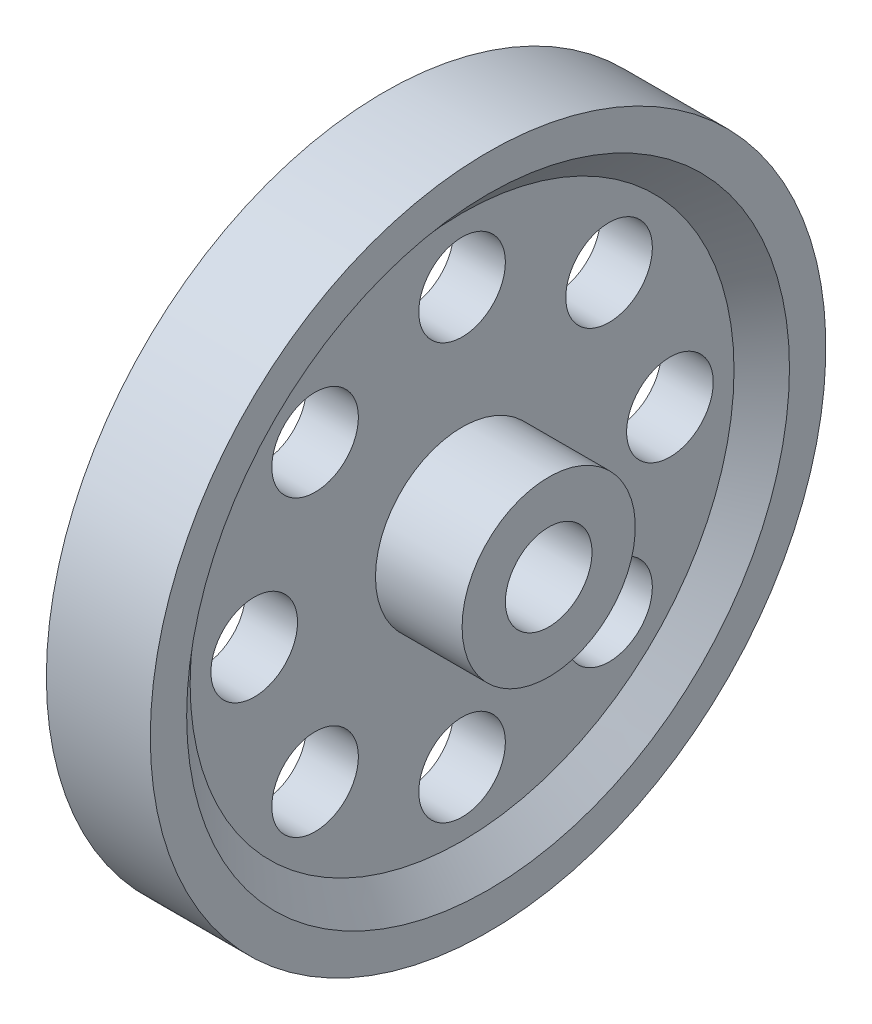
ISO-10303-21;
HEADER;
FILE_DESCRIPTION(('STEP AP214'),'2;1');
FILE_NAME('part.step','',(''),(''),'','','');
FILE_SCHEMA(('AUTOMOTIVE_DESIGN { 1 0 10303 214 1 1 1 1 }'));
ENDSEC;
DATA;
#1=APPLICATION_CONTEXT('core data for automotive mechanical design processes');
#2=APPLICATION_PROTOCOL_DEFINITION('international standard','automotive_design',2000,#1);
#3=PRODUCT_CONTEXT('',#1,'mechanical');
#4=PRODUCT('Part','Part','',(#3));
#5=PRODUCT_RELATED_PRODUCT_CATEGORY('part','',(#4));
#6=PRODUCT_DEFINITION_FORMATION('','',#4);
#7=PRODUCT_DEFINITION_CONTEXT('part definition',#1,'design');
#8=PRODUCT_DEFINITION('design','',#6,#7);
#9=PRODUCT_DEFINITION_SHAPE('','',#8);
#10=(LENGTH_UNIT() NAMED_UNIT(*) SI_UNIT(.MILLI.,.METRE.));
#11=(NAMED_UNIT(*) PLANE_ANGLE_UNIT() SI_UNIT($,.RADIAN.));
#12=(NAMED_UNIT(*) SI_UNIT($,.STERADIAN.) SOLID_ANGLE_UNIT());
#13=UNCERTAINTY_MEASURE_WITH_UNIT(LENGTH_MEASURE(1.E-05),#10,'distance_accuracy_value','');
#14=(GEOMETRIC_REPRESENTATION_CONTEXT(3) GLOBAL_UNCERTAINTY_ASSIGNED_CONTEXT((#13)) GLOBAL_UNIT_ASSIGNED_CONTEXT((#10,
#11,#12)) REPRESENTATION_CONTEXT('',''));
#15=CARTESIAN_POINT('',(0.,0.,0.));
#16=DIRECTION('',(0.,0.,1.));
#17=DIRECTION('',(1.,0.,0.));
#18=AXIS2_PLACEMENT_3D('',#15,#16,#17);
#19=CARTESIAN_POINT('',(0.,0.,0.));
#20=DIRECTION('',(-1.,0.,0.));
#21=DIRECTION('',(0.,0.,1.));
#22=AXIS2_PLACEMENT_3D('',#19,#20,#21);
#23=CYLINDRICAL_SURFACE('',#22,2.5);
#24=CARTESIAN_POINT('',(-1.,0.,0.));
#25=DIRECTION('',(-1.,0.,0.));
#26=DIRECTION('',(0.,0.,1.));
#27=AXIS2_PLACEMENT_3D('',#24,#25,#26);
#28=CIRCLE('',#27,2.5);
#29=CARTESIAN_POINT('',(-1.,0.,2.5));
#30=VERTEX_POINT('',#29);
#31=EDGE_CURVE('E71',#30,#30,#28,.T.);
#32=ORIENTED_EDGE('',*,*,#31,.T.);
#33=EDGE_LOOP('',(#32));
#34=FACE_BOUND('',#33,.T.);
#35=CARTESIAN_POINT('',(8.,0.,0.));
#36=DIRECTION('',(-1.,0.,0.));
#37=DIRECTION('',(0.,0.,1.));
#38=AXIS2_PLACEMENT_3D('',#35,#36,#37);
#39=CIRCLE('',#38,2.5);
#40=CARTESIAN_POINT('',(8.,0.,2.5));
#41=VERTEX_POINT('',#40);
#42=EDGE_CURVE('E10',#41,#41,#39,.T.);
#43=ORIENTED_EDGE('',*,*,#42,.F.);
#44=EDGE_LOOP('',(#43));
#45=FACE_BOUND('',#44,.T.);
#46=ADVANCED_FACE('F32',(#34,#45),#23,.F.);
#47=CARTESIAN_POINT('',(8.,0.,0.));
#48=DIRECTION('',(1.,0.,0.));
#49=DIRECTION('',(0.,0.,-1.));
#50=AXIS2_PLACEMENT_3D('',#47,#48,#49);
#51=PLANE('',#50);
#52=ORIENTED_EDGE('',*,*,#42,.T.);
#53=EDGE_LOOP('',(#52));
#54=FACE_BOUND('',#53,.T.);
#55=CARTESIAN_POINT('',(8.,0.,0.));
#56=DIRECTION('',(-1.,0.,0.));
#57=DIRECTION('',(0.,0.,1.));
#58=AXIS2_PLACEMENT_3D('',#55,#56,#57);
#59=CIRCLE('',#58,5.);
#60=CARTESIAN_POINT('',(8.,0.,5.));
#61=VERTEX_POINT('',#60);
#62=EDGE_CURVE('E39',#61,#61,#59,.T.);
#63=ORIENTED_EDGE('',*,*,#62,.F.);
#64=EDGE_LOOP('',(#63));
#65=FACE_BOUND('',#64,.T.);
#66=ADVANCED_FACE('F112',(#54,#65),#51,.T.);
#67=CARTESIAN_POINT('',(0.,0.,0.));
#68=DIRECTION('',(-1.,0.,0.));
#69=DIRECTION('',(0.,0.,1.));
#70=AXIS2_PLACEMENT_3D('',#67,#68,#69);
#71=CYLINDRICAL_SURFACE('',#70,5.);
#72=ORIENTED_EDGE('',*,*,#62,.T.);
#73=EDGE_LOOP('',(#72));
#74=FACE_BOUND('',#73,.T.);
#75=CARTESIAN_POINT('',(3.00000000000001,0.,0.));
#76=DIRECTION('',(-1.,0.,0.));
#77=DIRECTION('',(0.,0.,1.));
#78=AXIS2_PLACEMENT_3D('',#75,#76,#77);
#79=CIRCLE('',#78,5.);
#80=CARTESIAN_POINT('',(3.00000000000001,0.,5.));
#81=VERTEX_POINT('',#80);
#82=EDGE_CURVE('E44',#81,#81,#79,.T.);
#83=ORIENTED_EDGE('',*,*,#82,.F.);
#84=EDGE_LOOP('',(#83));
#85=FACE_BOUND('',#84,.T.);
#86=ADVANCED_FACE('F110',(#74,#85),#71,.T.);
#87=CARTESIAN_POINT('',(3.,0.,0.));
#88=DIRECTION('',(1.,0.,0.));
#89=DIRECTION('',(0.,0.,-1.));
#90=AXIS2_PLACEMENT_3D('',#87,#88,#89);
#91=PLANE('',#90);
#92=CARTESIAN_POINT('',(3.,8.48528137423785,8.48528137423827));
#93=DIRECTION('',(1.,0.,0.));
#94=DIRECTION('',(0.,0.,-1.));
#95=AXIS2_PLACEMENT_3D('',#92,#93,#94);
#96=CIRCLE('',#95,2.50000000000064);
#97=CARTESIAN_POINT('',(3.,8.48528137423785,5.98528137423763));
#98=VERTEX_POINT('',#97);
#99=EDGE_CURVE('E304',#98,#98,#96,.T.);
#100=ORIENTED_EDGE('',*,*,#99,.F.);
#101=EDGE_LOOP('',(#100));
#102=FACE_BOUND('',#101,.T.);
#103=CARTESIAN_POINT('',(3.,-1.02293661013471E-12,11.999999999999));
#104=DIRECTION('',(1.,0.,0.));
#105=DIRECTION('',(0.,0.,-1.));
#106=AXIS2_PLACEMENT_3D('',#103,#104,#105);
#107=CIRCLE('',#106,2.5000000000014);
#108=CARTESIAN_POINT('',(3.,-1.02293661013471E-12,9.49999999999758));
#109=VERTEX_POINT('',#108);
#110=EDGE_CURVE('E305',#109,#109,#107,.T.);
#111=ORIENTED_EDGE('',*,*,#110,.F.);
#112=EDGE_LOOP('',(#111));
#113=FACE_BOUND('',#112,.T.);
#114=CARTESIAN_POINT('',(3.,-8.48528137423929,8.48528137423683));
#115=DIRECTION('',(1.,0.,0.));
#116=DIRECTION('',(0.,0.,-1.));
#117=AXIS2_PLACEMENT_3D('',#114,#115,#116);
#118=CIRCLE('',#117,2.50000000000198);
#119=CARTESIAN_POINT('',(3.,-8.48528137423929,5.98528137423485));
#120=VERTEX_POINT('',#119);
#121=EDGE_CURVE('E307',#120,#120,#118,.T.);
#122=ORIENTED_EDGE('',*,*,#121,.F.);
#123=EDGE_LOOP('',(#122));
#124=FACE_BOUND('',#123,.T.);
#125=CARTESIAN_POINT('',(3.,-12.,-2.04293406795148E-12));
#126=DIRECTION('',(1.,0.,0.));
#127=DIRECTION('',(0.,0.,-1.));
#128=AXIS2_PLACEMENT_3D('',#125,#126,#127);
#129=CIRCLE('',#128,2.50000000000203);
#130=CARTESIAN_POINT('',(3.,-12.,-2.50000000000408));
#131=VERTEX_POINT('',#130);
#132=EDGE_CURVE('E312',#131,#131,#129,.T.);
#133=ORIENTED_EDGE('',*,*,#132,.F.);
#134=EDGE_LOOP('',(#133));
#135=FACE_BOUND('',#134,.T.);
#136=CARTESIAN_POINT('',(3.,-8.48528137423785,-8.48528137424031));
#137=DIRECTION('',(1.,0.,0.));
#138=DIRECTION('',(0.,0.,-1.));
#139=AXIS2_PLACEMENT_3D('',#136,#137,#138);
#140=CIRCLE('',#139,2.50000000000152);
#141=CARTESIAN_POINT('',(3.,-8.48528137423785,-10.9852813742418));
#142=VERTEX_POINT('',#141);
#143=EDGE_CURVE('E315',#142,#142,#140,.T.);
#144=ORIENTED_EDGE('',*,*,#143,.F.);
#145=EDGE_LOOP('',(#144));
#146=FACE_BOUND('',#145,.T.);
#147=CARTESIAN_POINT('',(3.,1.02146703397574E-12,-12.000000000001));
#148=DIRECTION('',(1.,0.,0.));
#149=DIRECTION('',(0.,0.,-1.));
#150=AXIS2_PLACEMENT_3D('',#147,#148,#149);
#151=CIRCLE('',#150,2.50000000000072);
#152=CARTESIAN_POINT('',(3.,1.02146703397574E-12,-14.5000000000017));
#153=VERTEX_POINT('',#152);
#154=EDGE_CURVE('E318',#153,#153,#151,.T.);
#155=ORIENTED_EDGE('',*,*,#154,.F.);
#156=EDGE_LOOP('',(#155));
#157=FACE_BOUND('',#156,.T.);
#158=CARTESIAN_POINT('',(3.,8.48528137423929,-8.48528137423887));
#159=DIRECTION('',(1.,0.,0.));
#160=DIRECTION('',(0.,0.,-1.));
#161=AXIS2_PLACEMENT_3D('',#158,#159,#160);
#162=CIRCLE('',#161,2.5000000000001);
#163=CARTESIAN_POINT('',(3.,8.48528137423929,-10.985281374239));
#164=VERTEX_POINT('',#163);
#165=EDGE_CURVE('E321',#164,#164,#162,.T.);
#166=ORIENTED_EDGE('',*,*,#165,.F.);
#167=EDGE_LOOP('',(#166));
#168=FACE_BOUND('',#167,.T.);
#169=CARTESIAN_POINT('',(3.,12.,0.));
#170=DIRECTION('',(1.,0.,0.));
#171=DIRECTION('',(0.,0.,-1.));
#172=AXIS2_PLACEMENT_3D('',#169,#170,#171);
#173=CIRCLE('',#172,2.5);
#174=CARTESIAN_POINT('',(3.,12.,-2.5));
#175=VERTEX_POINT('',#174);
#176=EDGE_CURVE('E52',#175,#175,#173,.T.);
#177=ORIENTED_EDGE('',*,*,#176,.F.);
#178=EDGE_LOOP('',(#177));
#179=FACE_BOUND('',#178,.T.);
#180=ORIENTED_EDGE('',*,*,#82,.T.);
#181=EDGE_LOOP('',(#180));
#182=FACE_BOUND('',#181,.T.);
#183=CARTESIAN_POINT('',(3.,0.,0.));
#184=DIRECTION('',(-1.,0.,0.));
#185=DIRECTION('',(0.,0.,1.));
#186=AXIS2_PLACEMENT_3D('',#183,#184,#185);
#187=CIRCLE('',#186,15.7);
#188=CARTESIAN_POINT('',(3.,0.,15.7));
#189=VERTEX_POINT('',#188);
#190=EDGE_CURVE('E102',#189,#189,#187,.T.);
#191=ORIENTED_EDGE('',*,*,#190,.F.);
#192=EDGE_LOOP('',(#191));
#193=FACE_BOUND('',#192,.T.);
#194=ADVANCED_FACE('F107',(#102,#113,#124,#135,#146,#157,#168,#179,#182,#193),#91,.T.);
#195=CARTESIAN_POINT('',(4.5,0.,0.));
#196=DIRECTION('',(1.,0.,0.));
#197=DIRECTION('',(0.,0.,-1.));
#198=AXIS2_PLACEMENT_3D('',#195,#196,#197);
#199=CONICAL_SURFACE('',#198,17.4,0.847816973393407);
#200=ORIENTED_EDGE('',*,*,#190,.T.);
#201=EDGE_LOOP('',(#200));
#202=FACE_BOUND('',#201,.T.);
#203=CARTESIAN_POINT('',(4.5,0.,0.));
#204=DIRECTION('',(-1.,0.,0.));
#205=DIRECTION('',(0.,0.,1.));
#206=AXIS2_PLACEMENT_3D('',#203,#204,#205);
#207=CIRCLE('',#206,17.4);
#208=CARTESIAN_POINT('',(4.5,0.,17.4));
#209=VERTEX_POINT('',#208);
#210=EDGE_CURVE('E99',#209,#209,#207,.T.);
#211=ORIENTED_EDGE('',*,*,#210,.F.);
#212=EDGE_LOOP('',(#211));
#213=FACE_BOUND('',#212,.T.);
#214=ADVANCED_FACE('F119',(#202,#213),#199,.F.);
#215=CARTESIAN_POINT('',(4.5,0.,0.));
#216=DIRECTION('',(1.,0.,0.));
#217=DIRECTION('',(0.,0.,-1.));
#218=AXIS2_PLACEMENT_3D('',#215,#216,#217);
#219=PLANE('',#218);
#220=ORIENTED_EDGE('',*,*,#210,.T.);
#221=EDGE_LOOP('',(#220));
#222=FACE_BOUND('',#221,.T.);
#223=CARTESIAN_POINT('',(4.5,0.,0.));
#224=DIRECTION('',(-1.,0.,0.));
#225=DIRECTION('',(0.,0.,1.));
#226=AXIS2_PLACEMENT_3D('',#223,#224,#225);
#227=CIRCLE('',#226,19.5);
#228=CARTESIAN_POINT('',(4.5,0.,19.5));
#229=VERTEX_POINT('',#228);
#230=EDGE_CURVE('E96',#229,#229,#227,.T.);
#231=ORIENTED_EDGE('',*,*,#230,.F.);
#232=EDGE_LOOP('',(#231));
#233=FACE_BOUND('',#232,.T.);
#234=ADVANCED_FACE('F144',(#222,#233),#219,.T.);
#235=CARTESIAN_POINT('',(0.,0.,0.));
#236=DIRECTION('',(-1.,0.,0.));
#237=DIRECTION('',(0.,0.,1.));
#238=AXIS2_PLACEMENT_3D('',#235,#236,#237);
#239=CYLINDRICAL_SURFACE('',#238,19.5);
#240=ORIENTED_EDGE('',*,*,#230,.T.);
#241=EDGE_LOOP('',(#240));
#242=FACE_BOUND('',#241,.T.);
#243=CARTESIAN_POINT('',(-1.5,0.,0.));
#244=DIRECTION('',(-1.,0.,0.));
#245=DIRECTION('',(0.,0.,1.));
#246=AXIS2_PLACEMENT_3D('',#243,#244,#245);
#247=CIRCLE('',#246,19.5);
#248=CARTESIAN_POINT('',(-1.5,0.,19.5));
#249=VERTEX_POINT('',#248);
#250=EDGE_CURVE('E93',#249,#249,#247,.T.);
#251=ORIENTED_EDGE('',*,*,#250,.F.);
#252=EDGE_LOOP('',(#251));
#253=FACE_BOUND('',#252,.T.);
#254=ADVANCED_FACE('F154',(#242,#253),#239,.T.);
#255=CARTESIAN_POINT('',(-1.5,0.,0.));
#256=DIRECTION('',(-1.,0.,0.));
#257=DIRECTION('',(0.,0.,1.));
#258=AXIS2_PLACEMENT_3D('',#255,#256,#257);
#259=PLANE('',#258);
#260=ORIENTED_EDGE('',*,*,#250,.T.);
#261=EDGE_LOOP('',(#260));
#262=FACE_BOUND('',#261,.T.);
#263=CARTESIAN_POINT('',(-1.5,0.,0.));
#264=DIRECTION('',(-1.,0.,0.));
#265=DIRECTION('',(0.,0.,1.));
#266=AXIS2_PLACEMENT_3D('',#263,#264,#265);
#267=CIRCLE('',#266,17.4);
#268=CARTESIAN_POINT('',(-1.5,0.,17.4));
#269=VERTEX_POINT('',#268);
#270=EDGE_CURVE('E90',#269,#269,#267,.T.);
#271=ORIENTED_EDGE('',*,*,#270,.F.);
#272=EDGE_LOOP('',(#271));
#273=FACE_BOUND('',#272,.T.);
#274=ADVANCED_FACE('F164',(#262,#273),#259,.T.);
#275=CARTESIAN_POINT('',(0.,0.,0.));
#276=DIRECTION('',(-1.,0.,0.));
#277=DIRECTION('',(0.,0.,1.));
#278=AXIS2_PLACEMENT_3D('',#275,#276,#277);
#279=CONICAL_SURFACE('',#278,15.7,0.847816973393405);
#280=ORIENTED_EDGE('',*,*,#270,.T.);
#281=EDGE_LOOP('',(#280));
#282=FACE_BOUND('',#281,.T.);
#283=CARTESIAN_POINT('',(0.,0.,0.));
#284=DIRECTION('',(-1.,0.,0.));
#285=DIRECTION('',(0.,0.,1.));
#286=AXIS2_PLACEMENT_3D('',#283,#284,#285);
#287=CIRCLE('',#286,15.7);
#288=CARTESIAN_POINT('',(0.,0.,15.7));
#289=VERTEX_POINT('',#288);
#290=EDGE_CURVE('E87',#289,#289,#287,.T.);
#291=ORIENTED_EDGE('',*,*,#290,.F.);
#292=EDGE_LOOP('',(#291));
#293=FACE_BOUND('',#292,.T.);
#294=ADVANCED_FACE('F174',(#282,#293),#279,.F.);
#295=CARTESIAN_POINT('',(0.,0.,0.));
#296=DIRECTION('',(-1.,0.,0.));
#297=DIRECTION('',(0.,0.,1.));
#298=AXIS2_PLACEMENT_3D('',#295,#296,#297);
#299=PLANE('',#298);
#300=CARTESIAN_POINT('',(0.,8.48528137423785,8.48528137423827));
#301=DIRECTION('',(-1.,0.,0.));
#302=DIRECTION('',(0.,0.,1.));
#303=AXIS2_PLACEMENT_3D('',#300,#301,#302);
#304=CIRCLE('',#303,2.50000000000064);
#305=CARTESIAN_POINT('',(0.,8.48528137423785,10.9852813742389));
#306=VERTEX_POINT('',#305);
#307=EDGE_CURVE('E35',#306,#306,#304,.T.);
#308=ORIENTED_EDGE('',*,*,#307,.F.);
#309=EDGE_LOOP('',(#308));
#310=FACE_BOUND('',#309,.T.);
#311=CARTESIAN_POINT('',(0.,-1.02293661013471E-12,11.999999999999));
#312=DIRECTION('',(-1.,0.,0.));
#313=DIRECTION('',(0.,0.,1.));
#314=AXIS2_PLACEMENT_3D('',#311,#312,#313);
#315=CIRCLE('',#314,2.5000000000014);
#316=CARTESIAN_POINT('',(0.,-1.02293661013471E-12,14.5000000000004));
#317=VERTEX_POINT('',#316);
#318=EDGE_CURVE('E66',#317,#317,#315,.T.);
#319=ORIENTED_EDGE('',*,*,#318,.F.);
#320=EDGE_LOOP('',(#319));
#321=FACE_BOUND('',#320,.T.);
#322=CARTESIAN_POINT('',(0.,-8.48528137423929,8.48528137423683));
#323=DIRECTION('',(-1.,0.,0.));
#324=DIRECTION('',(0.,0.,1.));
#325=AXIS2_PLACEMENT_3D('',#322,#323,#324);
#326=CIRCLE('',#325,2.50000000000198);
#327=CARTESIAN_POINT('',(0.,-8.48528137423929,10.9852813742388));
#328=VERTEX_POINT('',#327);
#329=EDGE_CURVE('E64',#328,#328,#326,.T.);
#330=ORIENTED_EDGE('',*,*,#329,.F.);
#331=EDGE_LOOP('',(#330));
#332=FACE_BOUND('',#331,.T.);
#333=CARTESIAN_POINT('',(0.,-12.,-2.04293406795148E-12));
#334=DIRECTION('',(-1.,0.,0.));
#335=DIRECTION('',(0.,0.,1.));
#336=AXIS2_PLACEMENT_3D('',#333,#334,#335);
#337=CIRCLE('',#336,2.50000000000203);
#338=CARTESIAN_POINT('',(0.,-12.,2.49999999999999));
#339=VERTEX_POINT('',#338);
#340=EDGE_CURVE('E61',#339,#339,#337,.T.);
#341=ORIENTED_EDGE('',*,*,#340,.F.);
#342=EDGE_LOOP('',(#341));
#343=FACE_BOUND('',#342,.T.);
#344=CARTESIAN_POINT('',(0.,-8.48528137423785,-8.48528137424031));
#345=DIRECTION('',(-1.,0.,0.));
#346=DIRECTION('',(0.,0.,1.));
#347=AXIS2_PLACEMENT_3D('',#344,#345,#346);
#348=CIRCLE('',#347,2.50000000000152);
#349=CARTESIAN_POINT('',(0.,-8.48528137423785,-5.9852813742388));
#350=VERTEX_POINT('',#349);
#351=EDGE_CURVE('E58',#350,#350,#348,.T.);
#352=ORIENTED_EDGE('',*,*,#351,.F.);
#353=EDGE_LOOP('',(#352));
#354=FACE_BOUND('',#353,.T.);
#355=CARTESIAN_POINT('',(0.,1.02146703397574E-12,-12.000000000001));
#356=DIRECTION('',(-1.,0.,0.));
#357=DIRECTION('',(0.,0.,1.));
#358=AXIS2_PLACEMENT_3D('',#355,#356,#357);
#359=CIRCLE('',#358,2.50000000000072);
#360=CARTESIAN_POINT('',(0.,1.02146703397574E-12,-9.5000000000003));
#361=VERTEX_POINT('',#360);
#362=EDGE_CURVE('E55',#361,#361,#359,.T.);
#363=ORIENTED_EDGE('',*,*,#362,.F.);
#364=EDGE_LOOP('',(#363));
#365=FACE_BOUND('',#364,.T.);
#366=CARTESIAN_POINT('',(0.,8.48528137423929,-8.48528137423887));
#367=DIRECTION('',(-1.,0.,0.));
#368=DIRECTION('',(0.,0.,1.));
#369=AXIS2_PLACEMENT_3D('',#366,#367,#368);
#370=CIRCLE('',#369,2.5000000000001);
#371=CARTESIAN_POINT('',(0.,8.48528137423929,-5.98528137423877));
#372=VERTEX_POINT('',#371);
#373=EDGE_CURVE('E51',#372,#372,#370,.T.);
#374=ORIENTED_EDGE('',*,*,#373,.F.);
#375=EDGE_LOOP('',(#374));
#376=FACE_BOUND('',#375,.T.);
#377=CARTESIAN_POINT('',(0.,12.,0.));
#378=DIRECTION('',(-1.,0.,0.));
#379=DIRECTION('',(0.,0.,1.));
#380=AXIS2_PLACEMENT_3D('',#377,#378,#379);
#381=CIRCLE('',#380,2.5);
#382=CARTESIAN_POINT('',(0.,12.,2.5));
#383=VERTEX_POINT('',#382);
#384=EDGE_CURVE('E48',#383,#383,#381,.T.);
#385=ORIENTED_EDGE('',*,*,#384,.F.);
#386=EDGE_LOOP('',(#385));
#387=FACE_BOUND('',#386,.T.);
#388=ORIENTED_EDGE('',*,*,#290,.T.);
#389=EDGE_LOOP('',(#388));
#390=FACE_BOUND('',#389,.T.);
#391=CARTESIAN_POINT('',(0.,0.,0.));
#392=DIRECTION('',(-1.,0.,0.));
#393=DIRECTION('',(0.,0.,1.));
#394=AXIS2_PLACEMENT_3D('',#391,#392,#393);
#395=CIRCLE('',#394,7.);
#396=CARTESIAN_POINT('',(0.,0.,7.));
#397=VERTEX_POINT('',#396);
#398=EDGE_CURVE('E80',#397,#397,#395,.T.);
#399=ORIENTED_EDGE('',*,*,#398,.F.);
#400=EDGE_LOOP('',(#399));
#401=FACE_BOUND('',#400,.T.);
#402=ADVANCED_FACE('F184',(#310,#321,#332,#343,#354,#365,#376,#387,#390,#401),#299,.T.);
#403=CARTESIAN_POINT('',(0.,0.,0.));
#404=DIRECTION('',(1.,0.,0.));
#405=DIRECTION('',(0.,0.,-1.));
#406=AXIS2_PLACEMENT_3D('',#403,#404,#405);
#407=CONICAL_SURFACE('',#406,7.,0.785398163397449);
#408=CARTESIAN_POINT('',(-1.,0.,0.));
#409=DIRECTION('',(-1.,0.,0.));
#410=DIRECTION('',(0.,0.,1.));
#411=AXIS2_PLACEMENT_3D('',#408,#409,#410);
#412=CIRCLE('',#411,6.);
#413=CARTESIAN_POINT('',(-1.,0.,6.));
#414=VERTEX_POINT('',#413);
#415=EDGE_CURVE('E75',#414,#414,#412,.T.);
#416=ORIENTED_EDGE('',*,*,#415,.F.);
#417=EDGE_LOOP('',(#416));
#418=FACE_BOUND('',#417,.T.);
#419=ORIENTED_EDGE('',*,*,#398,.T.);
#420=EDGE_LOOP('',(#419));
#421=FACE_BOUND('',#420,.T.);
#422=ADVANCED_FACE('F192',(#418,#421),#407,.T.);
#423=CARTESIAN_POINT('',(-1.,0.,0.));
#424=DIRECTION('',(1.,0.,0.));
#425=DIRECTION('',(0.,0.,-1.));
#426=AXIS2_PLACEMENT_3D('',#423,#424,#425);
#427=PLANE('',#426);
#428=ORIENTED_EDGE('',*,*,#31,.F.);
#429=EDGE_LOOP('',(#428));
#430=FACE_BOUND('',#429,.T.);
#431=ORIENTED_EDGE('',*,*,#415,.T.);
#432=EDGE_LOOP('',(#431));
#433=FACE_BOUND('',#432,.T.);
#434=ADVANCED_FACE('F197',(#430,#433),#427,.F.);
#435=CARTESIAN_POINT('',(-1.5,12.,0.));
#436=DIRECTION('',(1.,0.,0.));
#437=DIRECTION('',(0.,0.,-1.));
#438=AXIS2_PLACEMENT_3D('',#435,#436,#437);
#439=CYLINDRICAL_SURFACE('',#438,2.5);
#440=ORIENTED_EDGE('',*,*,#384,.T.);
#441=EDGE_LOOP('',(#440));
#442=FACE_BOUND('',#441,.T.);
#443=ORIENTED_EDGE('',*,*,#176,.T.);
#444=EDGE_LOOP('',(#443));
#445=FACE_BOUND('',#444,.T.);
#446=ADVANCED_FACE('F207',(#442,#445),#439,.F.);
#447=CARTESIAN_POINT('',(-1.5,8.48528137423929,-8.48528137423887));
#448=DIRECTION('',(1.,0.,0.));
#449=DIRECTION('',(0.,0.,-1.));
#450=AXIS2_PLACEMENT_3D('',#447,#448,#449);
#451=CYLINDRICAL_SURFACE('',#450,2.5000000000001);
#452=ORIENTED_EDGE('',*,*,#373,.T.);
#453=EDGE_LOOP('',(#452));
#454=FACE_BOUND('',#453,.T.);
#455=ORIENTED_EDGE('',*,*,#165,.T.);
#456=EDGE_LOOP('',(#455));
#457=FACE_BOUND('',#456,.T.);
#458=ADVANCED_FACE('F229',(#454,#457),#451,.F.);
#459=CARTESIAN_POINT('',(-1.5,1.02146703397574E-12,-12.000000000001));
#460=DIRECTION('',(1.,0.,0.));
#461=DIRECTION('',(0.,0.,-1.));
#462=AXIS2_PLACEMENT_3D('',#459,#460,#461);
#463=CYLINDRICAL_SURFACE('',#462,2.50000000000072);
#464=ORIENTED_EDGE('',*,*,#362,.T.);
#465=EDGE_LOOP('',(#464));
#466=FACE_BOUND('',#465,.T.);
#467=ORIENTED_EDGE('',*,*,#154,.T.);
#468=EDGE_LOOP('',(#467));
#469=FACE_BOUND('',#468,.T.);
#470=ADVANCED_FACE('F239',(#466,#469),#463,.F.);
#471=CARTESIAN_POINT('',(-1.5,-8.48528137423785,-8.48528137424031));
#472=DIRECTION('',(1.,0.,0.));
#473=DIRECTION('',(0.,0.,-1.));
#474=AXIS2_PLACEMENT_3D('',#471,#472,#473);
#475=CYLINDRICAL_SURFACE('',#474,2.50000000000152);
#476=ORIENTED_EDGE('',*,*,#351,.T.);
#477=EDGE_LOOP('',(#476));
#478=FACE_BOUND('',#477,.T.);
#479=ORIENTED_EDGE('',*,*,#143,.T.);
#480=EDGE_LOOP('',(#479));
#481=FACE_BOUND('',#480,.T.);
#482=ADVANCED_FACE('F249',(#478,#481),#475,.F.);
#483=CARTESIAN_POINT('',(-1.5,-12.,-2.04293406795148E-12));
#484=DIRECTION('',(1.,0.,0.));
#485=DIRECTION('',(0.,0.,-1.));
#486=AXIS2_PLACEMENT_3D('',#483,#484,#485);
#487=CYLINDRICAL_SURFACE('',#486,2.50000000000203);
#488=ORIENTED_EDGE('',*,*,#340,.T.);
#489=EDGE_LOOP('',(#488));
#490=FACE_BOUND('',#489,.T.);
#491=ORIENTED_EDGE('',*,*,#132,.T.);
#492=EDGE_LOOP('',(#491));
#493=FACE_BOUND('',#492,.T.);
#494=ADVANCED_FACE('F259',(#490,#493),#487,.F.);
#495=CARTESIAN_POINT('',(-1.5,-8.48528137423929,8.48528137423683));
#496=DIRECTION('',(1.,0.,0.));
#497=DIRECTION('',(0.,0.,-1.));
#498=AXIS2_PLACEMENT_3D('',#495,#496,#497);
#499=CYLINDRICAL_SURFACE('',#498,2.50000000000198);
#500=ORIENTED_EDGE('',*,*,#329,.T.);
#501=EDGE_LOOP('',(#500));
#502=FACE_BOUND('',#501,.T.);
#503=ORIENTED_EDGE('',*,*,#121,.T.);
#504=EDGE_LOOP('',(#503));
#505=FACE_BOUND('',#504,.T.);
#506=ADVANCED_FACE('F269',(#502,#505),#499,.F.);
#507=CARTESIAN_POINT('',(-1.5,-1.02293661013471E-12,11.999999999999));
#508=DIRECTION('',(1.,0.,0.));
#509=DIRECTION('',(0.,0.,-1.));
#510=AXIS2_PLACEMENT_3D('',#507,#508,#509);
#511=CYLINDRICAL_SURFACE('',#510,2.5000000000014);
#512=ORIENTED_EDGE('',*,*,#318,.T.);
#513=EDGE_LOOP('',(#512));
#514=FACE_BOUND('',#513,.T.);
#515=ORIENTED_EDGE('',*,*,#110,.T.);
#516=EDGE_LOOP('',(#515));
#517=FACE_BOUND('',#516,.T.);
#518=ADVANCED_FACE('F279',(#514,#517),#511,.F.);
#519=CARTESIAN_POINT('',(-1.5,8.48528137423785,8.48528137423827));
#520=DIRECTION('',(1.,0.,0.));
#521=DIRECTION('',(0.,0.,-1.));
#522=AXIS2_PLACEMENT_3D('',#519,#520,#521);
#523=CYLINDRICAL_SURFACE('',#522,2.50000000000064);
#524=ORIENTED_EDGE('',*,*,#307,.T.);
#525=EDGE_LOOP('',(#524));
#526=FACE_BOUND('',#525,.T.);
#527=ORIENTED_EDGE('',*,*,#99,.T.);
#528=EDGE_LOOP('',(#527));
#529=FACE_BOUND('',#528,.T.);
#530=ADVANCED_FACE('F289',(#526,#529),#523,.F.);
#531=CLOSED_SHELL('',(#46,#66,#86,#194,#214,#234,#254,#274,#294,#402,#422,#434,#446,#458,#470,
#482,#494,#506,#518,#530));
#532=MANIFOLD_SOLID_BREP('B2',#531);
#533=ADVANCED_BREP_SHAPE_REPRESENTATION('',(#18,#532),#14);
#534=SHAPE_DEFINITION_REPRESENTATION(#9,#533);
ENDSEC;
END-ISO-10303-21;
